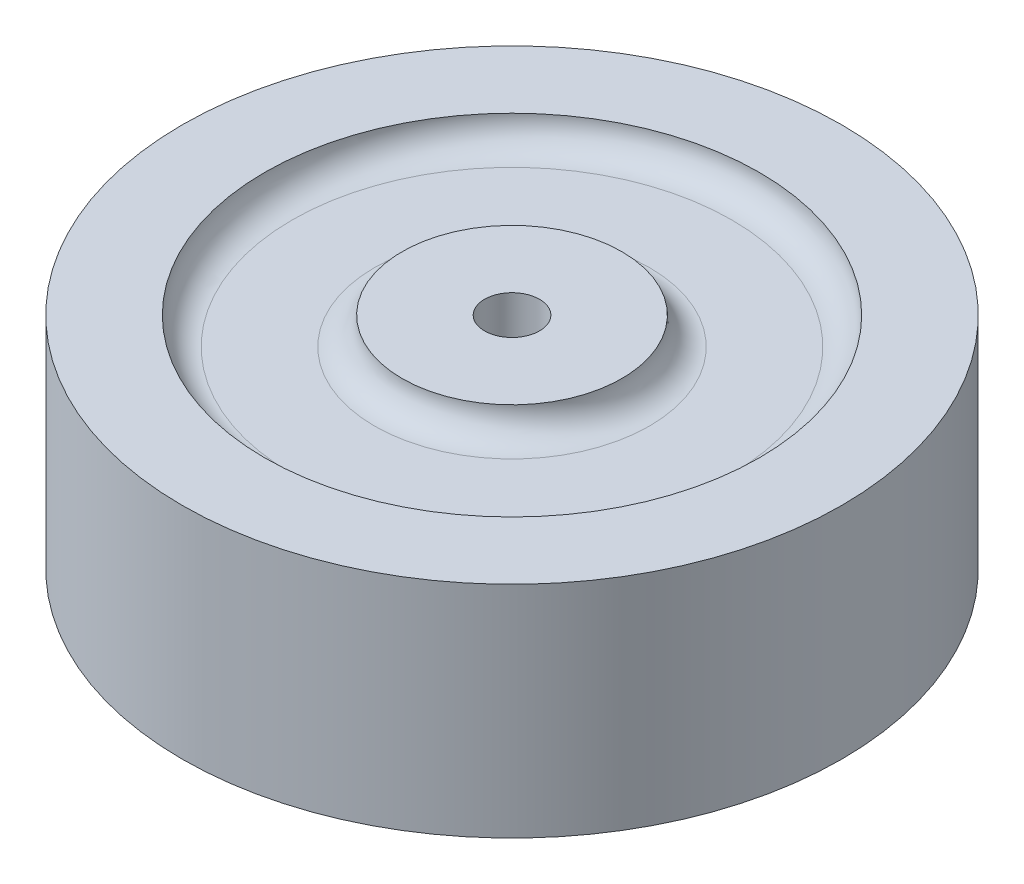
ISO-10303-21;
HEADER;
FILE_DESCRIPTION(('STEP AP214'),'2;1');
FILE_NAME('part.step','',(''),(''),'','','');
FILE_SCHEMA(('AUTOMOTIVE_DESIGN { 1 0 10303 214 1 1 1 1 }'));
ENDSEC;
DATA;
#1=APPLICATION_CONTEXT('core data for automotive mechanical design processes');
#2=APPLICATION_PROTOCOL_DEFINITION('international standard','automotive_design',2000,#1);
#3=PRODUCT_CONTEXT('',#1,'mechanical');
#4=PRODUCT('Part','Part','',(#3));
#5=PRODUCT_RELATED_PRODUCT_CATEGORY('part','',(#4));
#6=PRODUCT_DEFINITION_FORMATION('','',#4);
#7=PRODUCT_DEFINITION_CONTEXT('part definition',#1,'design');
#8=PRODUCT_DEFINITION('design','',#6,#7);
#9=PRODUCT_DEFINITION_SHAPE('','',#8);
#10=(LENGTH_UNIT() NAMED_UNIT(*) SI_UNIT(.MILLI.,.METRE.));
#11=(NAMED_UNIT(*) PLANE_ANGLE_UNIT() SI_UNIT($,.RADIAN.));
#12=(NAMED_UNIT(*) SI_UNIT($,.STERADIAN.) SOLID_ANGLE_UNIT());
#13=UNCERTAINTY_MEASURE_WITH_UNIT(LENGTH_MEASURE(1.E-05),#10,'distance_accuracy_value','');
#14=(GEOMETRIC_REPRESENTATION_CONTEXT(3) GLOBAL_UNCERTAINTY_ASSIGNED_CONTEXT((#13)) GLOBAL_UNIT_ASSIGNED_CONTEXT((#10,
#11,#12)) REPRESENTATION_CONTEXT('',''));
#15=CARTESIAN_POINT('',(0.,0.,0.));
#16=DIRECTION('',(0.,0.,1.));
#17=DIRECTION('',(1.,0.,0.));
#18=AXIS2_PLACEMENT_3D('',#15,#16,#17);
#19=CARTESIAN_POINT('',(0.,0.,0.));
#20=DIRECTION('',(0.,1.,0.));
#21=DIRECTION('',(0.,0.,1.));
#22=AXIS2_PLACEMENT_3D('',#19,#20,#21);
#23=PLANE('',#22);
#24=CARTESIAN_POINT('',(0.,0.,0.));
#25=DIRECTION('',(0.,1.,0.));
#26=DIRECTION('',(0.,0.,1.));
#27=AXIS2_PLACEMENT_3D('',#24,#25,#26);
#28=CIRCLE('',#27,25.4);
#29=CARTESIAN_POINT('',(0.,0.,25.4));
#30=VERTEX_POINT('',#29);
#31=EDGE_CURVE('E10',#30,#30,#28,.F.);
#32=ORIENTED_EDGE('',*,*,#31,.T.);
#33=EDGE_LOOP('',(#32));
#34=FACE_BOUND('',#33,.T.);
#35=CARTESIAN_POINT('',(0.,0.,0.));
#36=DIRECTION('',(0.,1.,0.));
#37=DIRECTION('',(0.,0.,1.));
#38=AXIS2_PLACEMENT_3D('',#35,#36,#37);
#39=CIRCLE('',#38,15.875);
#40=CARTESIAN_POINT('',(0.,0.,15.875));
#41=VERTEX_POINT('',#40);
#42=EDGE_CURVE('E39',#41,#41,#39,.T.);
#43=ORIENTED_EDGE('',*,*,#42,.T.);
#44=EDGE_LOOP('',(#43));
#45=FACE_BOUND('',#44,.T.);
#46=ADVANCED_FACE('F32',(#34,#45),#23,.F.);
#47=CARTESIAN_POINT('',(0.,19.05,0.));
#48=DIRECTION('',(0.,1.,0.));
#49=DIRECTION('',(0.,0.,1.));
#50=AXIS2_PLACEMENT_3D('',#47,#48,#49);
#51=PLANE('',#50);
#52=CARTESIAN_POINT('',(0.,19.05,0.));
#53=DIRECTION('',(0.,1.,0.));
#54=DIRECTION('',(0.,0.,1.));
#55=AXIS2_PLACEMENT_3D('',#52,#53,#54);
#56=CIRCLE('',#55,15.875);
#57=CARTESIAN_POINT('',(0.,19.05,15.875));
#58=VERTEX_POINT('',#57);
#59=EDGE_CURVE('E43',#58,#58,#56,.F.);
#60=ORIENTED_EDGE('',*,*,#59,.T.);
#61=EDGE_LOOP('',(#60));
#62=FACE_BOUND('',#61,.T.);
#63=CARTESIAN_POINT('',(0.,19.05,0.));
#64=DIRECTION('',(0.,1.,0.));
#65=DIRECTION('',(0.,0.,1.));
#66=AXIS2_PLACEMENT_3D('',#63,#64,#65);
#67=CIRCLE('',#66,25.4);
#68=CARTESIAN_POINT('',(0.,19.05,25.4));
#69=VERTEX_POINT('',#68);
#70=EDGE_CURVE('E47',#69,#69,#67,.T.);
#71=ORIENTED_EDGE('',*,*,#70,.T.);
#72=EDGE_LOOP('',(#71));
#73=FACE_BOUND('',#72,.T.);
#74=ADVANCED_FACE('F96',(#62,#73),#51,.T.);
#75=CARTESIAN_POINT('',(0.,19.05,0.));
#76=DIRECTION('',(0.,-1.,0.));
#77=DIRECTION('',(0.,0.,-1.));
#78=AXIS2_PLACEMENT_3D('',#75,#76,#77);
#79=CYLINDRICAL_SURFACE('',#78,38.1);
#80=CARTESIAN_POINT('',(0.,22.225,0.));
#81=DIRECTION('',(0.,1.,0.));
#82=DIRECTION('',(0.,0.,1.));
#83=AXIS2_PLACEMENT_3D('',#80,#81,#82);
#84=CIRCLE('',#83,38.1);
#85=CARTESIAN_POINT('',(0.,22.225,-38.1));
#86=VERTEX_POINT('',#85);
#87=EDGE_CURVE('E52',#86,#86,#84,.T.);
#88=CARTESIAN_POINT('',(0.,-3.175,0.));
#89=DIRECTION('',(0.,-1.,0.));
#90=DIRECTION('',(0.,0.,-1.));
#91=AXIS2_PLACEMENT_3D('',#88,#89,#90);
#92=CIRCLE('',#91,38.1);
#93=CARTESIAN_POINT('',(0.,-3.175,-38.1));
#94=VERTEX_POINT('',#93);
#95=EDGE_CURVE('E58',#94,#94,#92,.T.);
#96=CARTESIAN_POINT('',(0.,22.225,-38.1));
#97=CARTESIAN_POINT('',(0.,21.9604166666667,-38.1));
#98=CARTESIAN_POINT('',(0.,21.6958333333333,-38.1));
#99=CARTESIAN_POINT('',(0.,21.1666666666667,-38.1));
#100=CARTESIAN_POINT('',(0.,20.9020833333333,-38.1));
#101=CARTESIAN_POINT('',(0.,20.3729166666667,-38.1));
#102=CARTESIAN_POINT('',(0.,20.1083333333333,-38.1));
#103=CARTESIAN_POINT('',(0.,19.5791666666667,-38.1));
#104=CARTESIAN_POINT('',(0.,19.3145833333333,-38.1));
#105=CARTESIAN_POINT('',(0.,18.7854166666667,-38.1));
#106=CARTESIAN_POINT('',(0.,18.5208333333333,-38.1));
#107=CARTESIAN_POINT('',(0.,17.9916666666667,-38.1));
#108=CARTESIAN_POINT('',(0.,17.7270833333333,-38.1));
#109=CARTESIAN_POINT('',(0.,17.1979166666667,-38.1));
#110=CARTESIAN_POINT('',(0.,16.9333333333333,-38.1));
#111=CARTESIAN_POINT('',(0.,16.4041666666667,-38.1));
#112=CARTESIAN_POINT('',(0.,16.1395833333333,-38.1));
#113=CARTESIAN_POINT('',(0.,15.6104166666667,-38.1));
#114=CARTESIAN_POINT('',(0.,15.3458333333333,-38.1));
#115=CARTESIAN_POINT('',(0.,14.8166666666667,-38.1));
#116=CARTESIAN_POINT('',(0.,14.5520833333333,-38.1));
#117=CARTESIAN_POINT('',(0.,14.0229166666667,-38.1));
#118=CARTESIAN_POINT('',(0.,13.7583333333333,-38.1));
#119=CARTESIAN_POINT('',(0.,13.2291666666667,-38.1));
#120=CARTESIAN_POINT('',(0.,12.9645833333333,-38.1));
#121=CARTESIAN_POINT('',(0.,12.4354166666667,-38.1));
#122=CARTESIAN_POINT('',(0.,12.1708333333333,-38.1));
#123=CARTESIAN_POINT('',(0.,11.6416666666667,-38.1));
#124=CARTESIAN_POINT('',(0.,11.3770833333333,-38.1));
#125=CARTESIAN_POINT('',(0.,10.8479166666667,-38.1));
#126=CARTESIAN_POINT('',(0.,10.5833333333333,-38.1));
#127=CARTESIAN_POINT('',(0.,10.0541666666667,-38.1));
#128=CARTESIAN_POINT('',(0.,9.78958333333334,-38.1));
#129=CARTESIAN_POINT('',(0.,9.26041666666667,-38.1));
#130=CARTESIAN_POINT('',(0.,8.99583333333334,-38.1));
#131=CARTESIAN_POINT('',(0.,8.46666666666667,-38.1));
#132=CARTESIAN_POINT('',(0.,8.20208333333334,-38.1));
#133=CARTESIAN_POINT('',(0.,7.67291666666667,-38.1));
#134=CARTESIAN_POINT('',(0.,7.40833333333333,-38.1));
#135=CARTESIAN_POINT('',(0.,6.87916666666667,-38.1));
#136=CARTESIAN_POINT('',(0.,6.61458333333333,-38.1));
#137=CARTESIAN_POINT('',(0.,6.08541666666667,-38.1));
#138=CARTESIAN_POINT('',(0.,5.82083333333333,-38.1));
#139=CARTESIAN_POINT('',(0.,5.29166666666667,-38.1));
#140=CARTESIAN_POINT('',(0.,5.02708333333334,-38.1));
#141=CARTESIAN_POINT('',(0.,4.49791666666667,-38.1));
#142=CARTESIAN_POINT('',(0.,4.23333333333334,-38.1));
#143=CARTESIAN_POINT('',(0.,3.70416666666667,-38.1));
#144=CARTESIAN_POINT('',(0.,3.43958333333334,-38.1));
#145=CARTESIAN_POINT('',(0.,2.91041666666667,-38.1));
#146=CARTESIAN_POINT('',(0.,2.64583333333334,-38.1));
#147=CARTESIAN_POINT('',(0.,2.11666666666667,-38.1));
#148=CARTESIAN_POINT('',(0.,1.85208333333334,-38.1));
#149=CARTESIAN_POINT('',(0.,1.32291666666667,-38.1));
#150=CARTESIAN_POINT('',(0.,1.05833333333334,-38.1));
#151=CARTESIAN_POINT('',(0.,0.529166666666671,-38.1));
#152=CARTESIAN_POINT('',(0.,0.264583333333339,-38.1));
#153=CARTESIAN_POINT('',(0.,-0.264583333333327,-38.1));
#154=CARTESIAN_POINT('',(0.,-0.529166666666662,-38.1));
#155=CARTESIAN_POINT('',(0.,-1.05833333333333,-38.1));
#156=CARTESIAN_POINT('',(0.,-1.32291666666666,-38.1));
#157=CARTESIAN_POINT('',(0.,-1.85208333333333,-38.1));
#158=CARTESIAN_POINT('',(0.,-2.11666666666666,-38.1));
#159=CARTESIAN_POINT('',(0.,-2.64583333333333,-38.1));
#160=CARTESIAN_POINT('',(0.,-2.91041666666666,-38.1));
#161=CARTESIAN_POINT('',(0.,-3.175,-38.1));
#162=B_SPLINE_CURVE_WITH_KNOTS('',3,(#96,#97,#98,#99,#100,#101,#102,#103,#104,#105,#106,#107,
#108,#109,#110,#111,#112,#113,#114,#115,#116,#117,#118,#119,#120,#121,#122,#123,#124,#125,#126,
#127,#128,#129,#130,#131,#132,#133,#134,#135,#136,#137,#138,#139,#140,#141,#142,#143,#144,#145,
#146,#147,#148,#149,#150,#151,#152,#153,#154,#155,#156,#157,#158,#159,#160,#161),.UNSPECIFIED.,
.F.,.F.,(4,2,2,2,2,2,2,2,2,2,2,2,2,2,2,2,2,2,2,2,2,2,2,2,2,2,2,2,2,2,2,2,4),(0.,
0.793749999999999,1.5875,2.38125,3.175,3.96875,4.7625,5.55625,6.35,7.14375,7.9375,8.73125,9.525,
10.31875,11.1125,11.90625,12.7,13.49375,14.2875,15.08125,15.875,16.66875,17.4625,18.25625,19.05,
19.84375,20.6375,21.43125,22.225,23.01875,23.8125,24.60625,25.4),.UNSPECIFIED.);
#163=EDGE_CURVE('BSEAM101',#86,#94,#162,.T.);
#164=ORIENTED_EDGE('',*,*,#87,.F.);
#165=ORIENTED_EDGE('',*,*,#95,.F.);
#166=ORIENTED_EDGE('',*,*,#163,.T.);
#167=ORIENTED_EDGE('',*,*,#163,.F.);
#168=EDGE_LOOP('',(#164,#166,#165,#167));
#169=FACE_BOUND('',#168,.T.);
#170=ADVANCED_FACE('F101',(#169),#79,.T.);
#171=CARTESIAN_POINT('',(0.,19.05,0.));
#172=DIRECTION('',(0.,-1.,0.));
#173=DIRECTION('',(0.,0.,-1.));
#174=AXIS2_PLACEMENT_3D('',#171,#172,#173);
#175=CYLINDRICAL_SURFACE('',#174,3.175);
#176=CARTESIAN_POINT('',(0.,22.225,0.));
#177=DIRECTION('',(0.,1.,0.));
#178=DIRECTION('',(0.,0.,1.));
#179=AXIS2_PLACEMENT_3D('',#176,#177,#178);
#180=CIRCLE('',#179,3.175);
#181=CARTESIAN_POINT('',(0.,22.225,-3.175));
#182=VERTEX_POINT('',#181);
#183=EDGE_CURVE('E67',#182,#182,#180,.T.);
#184=CARTESIAN_POINT('',(0.,-3.175,0.));
#185=DIRECTION('',(0.,-1.,0.));
#186=DIRECTION('',(0.,0.,-1.));
#187=AXIS2_PLACEMENT_3D('',#184,#185,#186);
#188=CIRCLE('',#187,3.175);
#189=CARTESIAN_POINT('',(0.,-3.175,-3.175));
#190=VERTEX_POINT('',#189);
#191=EDGE_CURVE('E73',#190,#190,#188,.T.);
#192=CARTESIAN_POINT('',(0.,22.225,-3.175));
#193=CARTESIAN_POINT('',(0.,21.9604166666667,-3.175));
#194=CARTESIAN_POINT('',(0.,21.6958333333333,-3.175));
#195=CARTESIAN_POINT('',(0.,21.1666666666667,-3.175));
#196=CARTESIAN_POINT('',(0.,20.9020833333333,-3.175));
#197=CARTESIAN_POINT('',(0.,20.3729166666667,-3.175));
#198=CARTESIAN_POINT('',(0.,20.1083333333333,-3.175));
#199=CARTESIAN_POINT('',(0.,19.5791666666667,-3.175));
#200=CARTESIAN_POINT('',(0.,19.3145833333333,-3.175));
#201=CARTESIAN_POINT('',(0.,18.7854166666667,-3.175));
#202=CARTESIAN_POINT('',(0.,18.5208333333333,-3.175));
#203=CARTESIAN_POINT('',(0.,17.9916666666667,-3.175));
#204=CARTESIAN_POINT('',(0.,17.7270833333333,-3.175));
#205=CARTESIAN_POINT('',(0.,17.1979166666667,-3.175));
#206=CARTESIAN_POINT('',(0.,16.9333333333333,-3.175));
#207=CARTESIAN_POINT('',(0.,16.4041666666667,-3.175));
#208=CARTESIAN_POINT('',(0.,16.1395833333333,-3.175));
#209=CARTESIAN_POINT('',(0.,15.6104166666667,-3.175));
#210=CARTESIAN_POINT('',(0.,15.3458333333333,-3.175));
#211=CARTESIAN_POINT('',(0.,14.8166666666667,-3.175));
#212=CARTESIAN_POINT('',(0.,14.5520833333333,-3.175));
#213=CARTESIAN_POINT('',(0.,14.0229166666667,-3.175));
#214=CARTESIAN_POINT('',(0.,13.7583333333333,-3.175));
#215=CARTESIAN_POINT('',(0.,13.2291666666667,-3.175));
#216=CARTESIAN_POINT('',(0.,12.9645833333333,-3.175));
#217=CARTESIAN_POINT('',(0.,12.4354166666667,-3.175));
#218=CARTESIAN_POINT('',(0.,12.1708333333333,-3.175));
#219=CARTESIAN_POINT('',(0.,11.6416666666667,-3.175));
#220=CARTESIAN_POINT('',(0.,11.3770833333333,-3.175));
#221=CARTESIAN_POINT('',(0.,10.8479166666667,-3.175));
#222=CARTESIAN_POINT('',(0.,10.5833333333333,-3.175));
#223=CARTESIAN_POINT('',(0.,10.0541666666667,-3.175));
#224=CARTESIAN_POINT('',(0.,9.78958333333334,-3.175));
#225=CARTESIAN_POINT('',(0.,9.26041666666667,-3.175));
#226=CARTESIAN_POINT('',(0.,8.99583333333334,-3.175));
#227=CARTESIAN_POINT('',(0.,8.46666666666667,-3.175));
#228=CARTESIAN_POINT('',(0.,8.20208333333334,-3.175));
#229=CARTESIAN_POINT('',(0.,7.67291666666667,-3.175));
#230=CARTESIAN_POINT('',(0.,7.40833333333333,-3.175));
#231=CARTESIAN_POINT('',(0.,6.87916666666667,-3.175));
#232=CARTESIAN_POINT('',(0.,6.61458333333333,-3.175));
#233=CARTESIAN_POINT('',(0.,6.08541666666667,-3.175));
#234=CARTESIAN_POINT('',(0.,5.82083333333333,-3.175));
#235=CARTESIAN_POINT('',(0.,5.29166666666667,-3.175));
#236=CARTESIAN_POINT('',(0.,5.02708333333334,-3.175));
#237=CARTESIAN_POINT('',(0.,4.49791666666667,-3.175));
#238=CARTESIAN_POINT('',(0.,4.23333333333334,-3.175));
#239=CARTESIAN_POINT('',(0.,3.70416666666667,-3.175));
#240=CARTESIAN_POINT('',(0.,3.43958333333334,-3.175));
#241=CARTESIAN_POINT('',(0.,2.91041666666667,-3.175));
#242=CARTESIAN_POINT('',(0.,2.64583333333334,-3.175));
#243=CARTESIAN_POINT('',(0.,2.11666666666667,-3.175));
#244=CARTESIAN_POINT('',(0.,1.85208333333334,-3.175));
#245=CARTESIAN_POINT('',(0.,1.32291666666667,-3.175));
#246=CARTESIAN_POINT('',(0.,1.05833333333334,-3.175));
#247=CARTESIAN_POINT('',(0.,0.529166666666671,-3.175));
#248=CARTESIAN_POINT('',(0.,0.264583333333339,-3.175));
#249=CARTESIAN_POINT('',(0.,-0.264583333333327,-3.175));
#250=CARTESIAN_POINT('',(0.,-0.529166666666662,-3.175));
#251=CARTESIAN_POINT('',(0.,-1.05833333333333,-3.175));
#252=CARTESIAN_POINT('',(0.,-1.32291666666666,-3.175));
#253=CARTESIAN_POINT('',(0.,-1.85208333333333,-3.175));
#254=CARTESIAN_POINT('',(0.,-2.11666666666666,-3.175));
#255=CARTESIAN_POINT('',(0.,-2.64583333333333,-3.175));
#256=CARTESIAN_POINT('',(0.,-2.91041666666666,-3.175));
#257=CARTESIAN_POINT('',(0.,-3.175,-3.175));
#258=B_SPLINE_CURVE_WITH_KNOTS('',3,(#192,#193,#194,#195,#196,#197,#198,#199,#200,#201,#202,
#203,#204,#205,#206,#207,#208,#209,#210,#211,#212,#213,#214,#215,#216,#217,#218,#219,#220,#221,
#222,#223,#224,#225,#226,#227,#228,#229,#230,#231,#232,#233,#234,#235,#236,#237,#238,#239,#240,
#241,#242,#243,#244,#245,#246,#247,#248,#249,#250,#251,#252,#253,#254,#255,#256,#257),
.UNSPECIFIED.,.F.,.F.,(4,2,2,2,2,2,2,2,2,2,2,2,2,2,2,2,2,2,2,2,2,2,2,2,2,2,2,2,2,2,2,2,4),(0.,
0.793749999999999,1.5875,2.38125,3.175,3.96875,4.7625,5.55625,6.35,7.14375,7.9375,8.73125,9.525,
10.31875,11.1125,11.90625,12.7,13.49375,14.2875,15.08125,15.875,16.66875,17.4625,18.25625,19.05,
19.84375,20.6375,21.43125,22.225,23.01875,23.8125,24.60625,25.4),.UNSPECIFIED.);
#259=EDGE_CURVE('BSEAM77',#182,#190,#258,.T.);
#260=ORIENTED_EDGE('',*,*,#183,.T.);
#261=ORIENTED_EDGE('',*,*,#191,.T.);
#262=ORIENTED_EDGE('',*,*,#259,.T.);
#263=ORIENTED_EDGE('',*,*,#259,.F.);
#264=EDGE_LOOP('',(#260,#262,#261,#263));
#265=FACE_BOUND('',#264,.T.);
#266=ADVANCED_FACE('F77',(#265),#175,.F.);
#267=CARTESIAN_POINT('',(0.,22.225,0.));
#268=DIRECTION('',(0.,1.,0.));
#269=DIRECTION('',(0.,0.,1.));
#270=AXIS2_PLACEMENT_3D('',#267,#268,#269);
#271=PLANE('',#270);
#272=ORIENTED_EDGE('',*,*,#87,.T.);
#273=EDGE_LOOP('',(#272));
#274=FACE_BOUND('',#273,.T.);
#275=CARTESIAN_POINT('',(0.,22.225,0.));
#276=DIRECTION('',(0.,1.,0.));
#277=DIRECTION('',(0.,0.,1.));
#278=AXIS2_PLACEMENT_3D('',#275,#276,#277);
#279=CIRCLE('',#278,28.575);
#280=CARTESIAN_POINT('',(0.,22.225,28.575));
#281=VERTEX_POINT('',#280);
#282=EDGE_CURVE('E55',#281,#281,#279,.T.);
#283=ORIENTED_EDGE('',*,*,#282,.F.);
#284=EDGE_LOOP('',(#283));
#285=FACE_BOUND('',#284,.T.);
#286=ADVANCED_FACE('F122',(#274,#285),#271,.T.);
#287=CARTESIAN_POINT('',(0.,-3.175,0.));
#288=DIRECTION('',(0.,-1.,0.));
#289=DIRECTION('',(0.,0.,-1.));
#290=AXIS2_PLACEMENT_3D('',#287,#288,#289);
#291=PLANE('',#290);
#292=ORIENTED_EDGE('',*,*,#95,.T.);
#293=EDGE_LOOP('',(#292));
#294=FACE_BOUND('',#293,.T.);
#295=CARTESIAN_POINT('',(0.,-3.175,0.));
#296=DIRECTION('',(0.,-1.,0.));
#297=DIRECTION('',(0.,0.,-1.));
#298=AXIS2_PLACEMENT_3D('',#295,#296,#297);
#299=CIRCLE('',#298,28.575);
#300=CARTESIAN_POINT('',(0.,-3.175,-28.575));
#301=VERTEX_POINT('',#300);
#302=EDGE_CURVE('E61',#301,#301,#299,.T.);
#303=ORIENTED_EDGE('',*,*,#302,.F.);
#304=EDGE_LOOP('',(#303));
#305=FACE_BOUND('',#304,.T.);
#306=ADVANCED_FACE('F92',(#294,#305),#291,.T.);
#307=CARTESIAN_POINT('',(0.,22.225,0.));
#308=DIRECTION('',(0.,1.,0.));
#309=DIRECTION('',(0.,0.,1.));
#310=AXIS2_PLACEMENT_3D('',#307,#308,#309);
#311=PLANE('',#310);
#312=CARTESIAN_POINT('',(0.,22.225,0.));
#313=DIRECTION('',(0.,1.,0.));
#314=DIRECTION('',(0.,0.,1.));
#315=AXIS2_PLACEMENT_3D('',#312,#313,#314);
#316=CIRCLE('',#315,12.7);
#317=CARTESIAN_POINT('',(0.,22.225,12.7));
#318=VERTEX_POINT('',#317);
#319=EDGE_CURVE('E64',#318,#318,#316,.T.);
#320=ORIENTED_EDGE('',*,*,#319,.T.);
#321=EDGE_LOOP('',(#320));
#322=FACE_BOUND('',#321,.T.);
#323=ORIENTED_EDGE('',*,*,#183,.F.);
#324=EDGE_LOOP('',(#323));
#325=FACE_BOUND('',#324,.T.);
#326=ADVANCED_FACE('F82',(#322,#325),#311,.T.);
#327=CARTESIAN_POINT('',(0.,-3.175,0.));
#328=DIRECTION('',(0.,-1.,0.));
#329=DIRECTION('',(0.,0.,-1.));
#330=AXIS2_PLACEMENT_3D('',#327,#328,#329);
#331=PLANE('',#330);
#332=CARTESIAN_POINT('',(0.,-3.175,0.));
#333=DIRECTION('',(0.,-1.,0.));
#334=DIRECTION('',(0.,0.,-1.));
#335=AXIS2_PLACEMENT_3D('',#332,#333,#334);
#336=CIRCLE('',#335,12.7);
#337=CARTESIAN_POINT('',(0.,-3.175,-12.7));
#338=VERTEX_POINT('',#337);
#339=EDGE_CURVE('E70',#338,#338,#336,.T.);
#340=ORIENTED_EDGE('',*,*,#339,.T.);
#341=EDGE_LOOP('',(#340));
#342=FACE_BOUND('',#341,.T.);
#343=ORIENTED_EDGE('',*,*,#191,.F.);
#344=EDGE_LOOP('',(#343));
#345=FACE_BOUND('',#344,.T.);
#346=ADVANCED_FACE('F79',(#342,#345),#331,.T.);
#347=CARTESIAN_POINT('',(0.,22.225,0.));
#348=DIRECTION('',(0.,1.,0.));
#349=DIRECTION('',(0.,0.,1.));
#350=AXIS2_PLACEMENT_3D('',#347,#348,#349);
#351=TOROIDAL_SURFACE('',#350,15.875,3.175);
#352=ORIENTED_EDGE('',*,*,#59,.F.);
#353=EDGE_LOOP('',(#352));
#354=FACE_BOUND('',#353,.T.);
#355=ORIENTED_EDGE('',*,*,#319,.F.);
#356=EDGE_LOOP('',(#355));
#357=FACE_BOUND('',#356,.T.);
#358=ADVANCED_FACE('F81',(#354,#357),#351,.F.);
#359=CARTESIAN_POINT('',(0.,22.225,0.));
#360=DIRECTION('',(0.,1.,0.));
#361=DIRECTION('',(0.,0.,1.));
#362=AXIS2_PLACEMENT_3D('',#359,#360,#361);
#363=TOROIDAL_SURFACE('',#362,25.4,3.175);
#364=ORIENTED_EDGE('',*,*,#70,.F.);
#365=EDGE_LOOP('',(#364));
#366=FACE_BOUND('',#365,.T.);
#367=ORIENTED_EDGE('',*,*,#282,.T.);
#368=EDGE_LOOP('',(#367));
#369=FACE_BOUND('',#368,.T.);
#370=ADVANCED_FACE('F89',(#366,#369),#363,.F.);
#371=CARTESIAN_POINT('',(0.,-3.175,0.));
#372=DIRECTION('',(0.,1.,0.));
#373=DIRECTION('',(0.,0.,1.));
#374=AXIS2_PLACEMENT_3D('',#371,#372,#373);
#375=TOROIDAL_SURFACE('',#374,25.4,3.175);
#376=ORIENTED_EDGE('',*,*,#302,.T.);
#377=EDGE_LOOP('',(#376));
#378=FACE_BOUND('',#377,.T.);
#379=ORIENTED_EDGE('',*,*,#31,.F.);
#380=EDGE_LOOP('',(#379));
#381=FACE_BOUND('',#380,.T.);
#382=ADVANCED_FACE('F110',(#378,#381),#375,.F.);
#383=CARTESIAN_POINT('',(0.,-3.175,0.));
#384=DIRECTION('',(0.,1.,0.));
#385=DIRECTION('',(0.,0.,1.));
#386=AXIS2_PLACEMENT_3D('',#383,#384,#385);
#387=TOROIDAL_SURFACE('',#386,15.875,3.175);
#388=ORIENTED_EDGE('',*,*,#42,.F.);
#389=EDGE_LOOP('',(#388));
#390=FACE_BOUND('',#389,.T.);
#391=ORIENTED_EDGE('',*,*,#339,.F.);
#392=EDGE_LOOP('',(#391));
#393=FACE_BOUND('',#392,.T.);
#394=ADVANCED_FACE('F34',(#390,#393),#387,.F.);
#395=CLOSED_SHELL('',(#46,#74,#170,#266,#286,#306,#326,#346,#358,#370,#382,#394));
#396=MANIFOLD_SOLID_BREP('B2',#395);
#397=ADVANCED_BREP_SHAPE_REPRESENTATION('',(#18,#396),#14);
#398=SHAPE_DEFINITION_REPRESENTATION(#9,#397);
ENDSEC;
END-ISO-10303-21;
